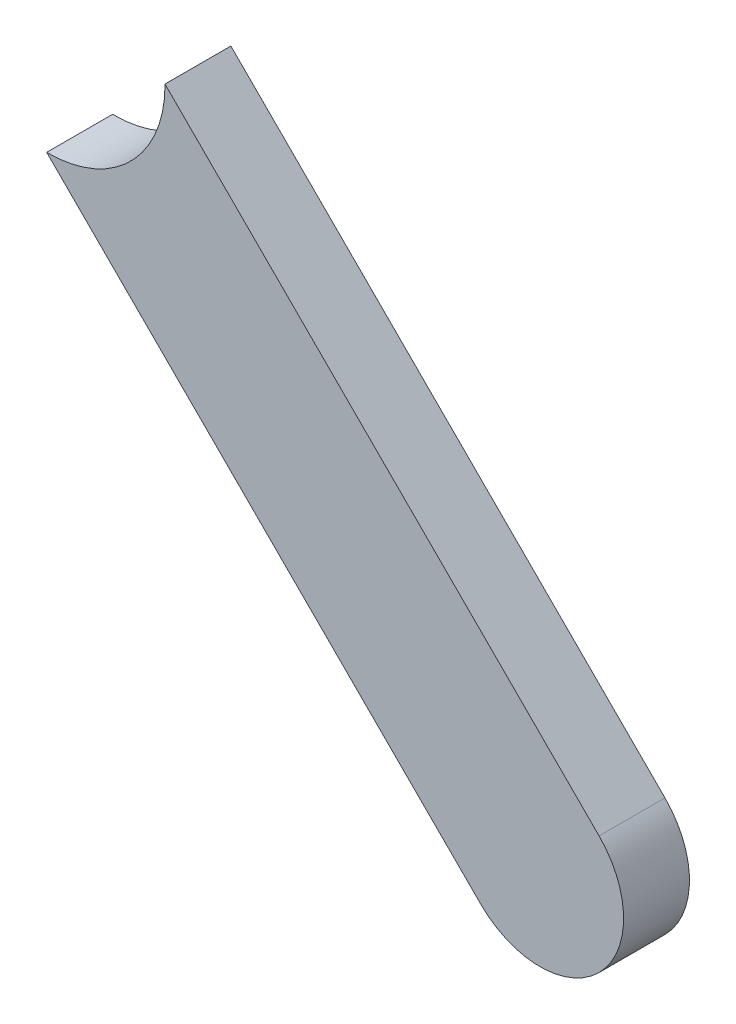
ISO-10303-21;
HEADER;
FILE_DESCRIPTION(('STEP AP214'),'2;1');
FILE_NAME('part.step','',(''),(''),'','','');
FILE_SCHEMA(('AUTOMOTIVE_DESIGN { 1 0 10303 214 1 1 1 1 }'));
ENDSEC;
DATA;
#1=APPLICATION_CONTEXT('core data for automotive mechanical design processes');
#2=APPLICATION_PROTOCOL_DEFINITION('international standard','automotive_design',2000,#1);
#3=PRODUCT_CONTEXT('',#1,'mechanical');
#4=PRODUCT('Part','Part','',(#3));
#5=PRODUCT_RELATED_PRODUCT_CATEGORY('part','',(#4));
#6=PRODUCT_DEFINITION_FORMATION('','',#4);
#7=PRODUCT_DEFINITION_CONTEXT('part definition',#1,'design');
#8=PRODUCT_DEFINITION('design','',#6,#7);
#9=PRODUCT_DEFINITION_SHAPE('','',#8);
#10=(LENGTH_UNIT() NAMED_UNIT(*) SI_UNIT(.MILLI.,.METRE.));
#11=(NAMED_UNIT(*) PLANE_ANGLE_UNIT() SI_UNIT($,.RADIAN.));
#12=(NAMED_UNIT(*) SI_UNIT($,.STERADIAN.) SOLID_ANGLE_UNIT());
#13=UNCERTAINTY_MEASURE_WITH_UNIT(LENGTH_MEASURE(1.E-05),#10,'distance_accuracy_value','');
#14=(GEOMETRIC_REPRESENTATION_CONTEXT(3) GLOBAL_UNCERTAINTY_ASSIGNED_CONTEXT((#13)) GLOBAL_UNIT_ASSIGNED_CONTEXT((#10,
#11,#12)) REPRESENTATION_CONTEXT('',''));
#15=CARTESIAN_POINT('',(0.,0.,0.));
#16=DIRECTION('',(0.,0.,1.));
#17=DIRECTION('',(1.,0.,0.));
#18=AXIS2_PLACEMENT_3D('',#15,#16,#17);
#19=CARTESIAN_POINT('',(145.284369587607,113.309418532393,0.));
#20=DIRECTION('',(0.707106781186548,0.707106781186548,0.));
#21=DIRECTION('',(0.707106781186548,-0.707106781186548,0.));
#22=AXIS2_PLACEMENT_3D('',#19,#20,#21);
#23=PLANE('',#22);
#24=DIRECTION('',(0.707106781186548,-0.707106781186548,0.));
#25=VECTOR('',#24,1.);
#26=CARTESIAN_POINT('',(145.10839406,113.48539406,0.1999996));
#27=LINE('',#26,#25);
#28=CARTESIAN_POINT('',(145.284369587607,113.309418532393,0.1999996));
#29=VERTEX_POINT('',#28);
#30=CARTESIAN_POINT('',(146.60242206,111.99136606,0.1999996));
#31=VERTEX_POINT('',#30);
#32=EDGE_CURVE('E11',#29,#31,#27,.T.);
#33=ORIENTED_EDGE('',*,*,#32,.F.);
#34=DIRECTION('',(0.,0.,1.));
#35=VECTOR('',#34,1.);
#36=CARTESIAN_POINT('',(145.284369587607,113.309418532393,0.));
#37=LINE('',#36,#35);
#38=CARTESIAN_POINT('',(145.284369587607,113.309418532393,0.));
#39=VERTEX_POINT('',#38);
#40=EDGE_CURVE('E24',#39,#29,#37,.T.);
#41=ORIENTED_EDGE('',*,*,#40,.F.);
#42=DIRECTION('',(0.707106781186548,-0.707106781186548,0.));
#43=VECTOR('',#42,1.);
#44=CARTESIAN_POINT('',(145.10839406,113.48539406,0.));
#45=LINE('',#44,#43);
#46=CARTESIAN_POINT('',(146.60242206,111.99136606,0.));
#47=VERTEX_POINT('',#46);
#48=EDGE_CURVE('E82',#39,#47,#45,.T.);
#49=ORIENTED_EDGE('',*,*,#48,.T.);
#50=DIRECTION('',(0.,0.,1.));
#51=VECTOR('',#50,1.);
#52=CARTESIAN_POINT('',(146.60242206,111.99136606,0.));
#53=LINE('',#52,#51);
#54=EDGE_CURVE('E37',#47,#31,#53,.T.);
#55=ORIENTED_EDGE('',*,*,#54,.T.);
#56=EDGE_LOOP('',(#33,#41,#49,#55));
#57=FACE_BOUND('',#56,.T.);
#58=ADVANCED_FACE('F17',(#57),#23,.F.);
#59=CARTESIAN_POINT('',(146.782028,112.170972,0.));
#60=DIRECTION('',(0.,0.,-1.));
#61=DIRECTION('',(-0.70710678118652,-0.707106781186576,0.));
#62=AXIS2_PLACEMENT_3D('',#59,#60,#61);
#63=CYLINDRICAL_SURFACE('',#62,0.254001156230771);
#64=CARTESIAN_POINT('',(146.782028,112.170972,0.1999996));
#65=DIRECTION('',(0.,0.,1.));
#66=DIRECTION('',(-0.70710678118652,-0.707106781186576,0.));
#67=AXIS2_PLACEMENT_3D('',#64,#65,#66);
#68=CIRCLE('',#67,0.254001156230771);
#69=CARTESIAN_POINT('',(146.96163394,112.35057794,0.1999996));
#70=VERTEX_POINT('',#69);
#71=EDGE_CURVE('E97',#31,#70,#68,.T.);
#72=ORIENTED_EDGE('',*,*,#71,.F.);
#73=ORIENTED_EDGE('',*,*,#54,.F.);
#74=CARTESIAN_POINT('',(146.782028,112.170972,0.));
#75=DIRECTION('',(0.,0.,1.));
#76=DIRECTION('',(-0.70710678118652,-0.707106781186576,0.));
#77=AXIS2_PLACEMENT_3D('',#74,#75,#76);
#78=CIRCLE('',#77,0.254001156230771);
#79=CARTESIAN_POINT('',(146.96163394,112.35057794,0.));
#80=VERTEX_POINT('',#79);
#81=EDGE_CURVE('E94',#47,#80,#78,.T.);
#82=ORIENTED_EDGE('',*,*,#81,.T.);
#83=DIRECTION('',(0.,0.,1.));
#84=VECTOR('',#83,1.);
#85=CARTESIAN_POINT('',(146.96163394,112.35057794,0.));
#86=LINE('',#85,#84);
#87=EDGE_CURVE('E92',#80,#70,#86,.T.);
#88=ORIENTED_EDGE('',*,*,#87,.T.);
#89=EDGE_LOOP('',(#72,#73,#82,#88));
#90=FACE_BOUND('',#89,.T.);
#91=ADVANCED_FACE('F103',(#90),#63,.T.);
#92=CARTESIAN_POINT('',(146.96163394,112.35057794,0.));
#93=DIRECTION('',(-0.707106781186551,-0.707106781186544,0.));
#94=DIRECTION('',(-0.707106781186544,0.707106781186551,0.));
#95=AXIS2_PLACEMENT_3D('',#92,#93,#94);
#96=PLANE('',#95);
#97=DIRECTION('',(-0.707106781186544,0.707106781186551,0.));
#98=VECTOR('',#97,1.);
#99=CARTESIAN_POINT('',(146.96163394,112.35057794,0.1999996));
#100=LINE('',#99,#98);
#101=CARTESIAN_POINT('',(145.643581467608,113.668630412393,0.1999996));
#102=VERTEX_POINT('',#101);
#103=EDGE_CURVE('E89',#70,#102,#100,.T.);
#104=ORIENTED_EDGE('',*,*,#103,.F.);
#105=ORIENTED_EDGE('',*,*,#87,.F.);
#106=DIRECTION('',(-0.707106781186544,0.707106781186551,0.));
#107=VECTOR('',#106,1.);
#108=CARTESIAN_POINT('',(146.96163394,112.35057794,0.));
#109=LINE('',#108,#107);
#110=CARTESIAN_POINT('',(145.643581467608,113.668630412393,0.));
#111=VERTEX_POINT('',#110);
#112=EDGE_CURVE('E87',#80,#111,#109,.T.);
#113=ORIENTED_EDGE('',*,*,#112,.T.);
#114=DIRECTION('',(0.,0.,1.));
#115=VECTOR('',#114,1.);
#116=CARTESIAN_POINT('',(145.643581467608,113.668630412393,0.));
#117=LINE('',#116,#115);
#118=EDGE_CURVE('E69',#111,#102,#117,.T.);
#119=ORIENTED_EDGE('',*,*,#118,.T.);
#120=EDGE_LOOP('',(#104,#105,#113,#119));
#121=FACE_BOUND('',#120,.T.);
#122=ADVANCED_FACE('F108',(#121),#96,.F.);
#123=CARTESIAN_POINT('',(145.288,113.665,0.));
#124=DIRECTION('',(0.,0.,-1.));
#125=DIRECTION('',(1.,0.,0.));
#126=AXIS2_PLACEMENT_3D('',#123,#124,#125);
#127=CYLINDRICAL_SURFACE('',#126,0.3556);
#128=DIRECTION('',(0.,0.,1.));
#129=VECTOR('',#128,1.);
#130=CARTESIAN_POINT('',(145.6436,113.665,0.));
#131=LINE('',#130,#129);
#132=CARTESIAN_POINT('',(145.6436,113.665,0.));
#133=VERTEX_POINT('',#132);
#134=CARTESIAN_POINT('',(145.6436,113.665,0.1999996));
#135=VERTEX_POINT('',#134);
#136=EDGE_CURVE('E59',#133,#135,#131,.T.);
#137=ORIENTED_EDGE('',*,*,#136,.T.);
#138=CARTESIAN_POINT('',(145.288,113.665,0.1999996));
#139=DIRECTION('',(0.,0.,1.));
#140=DIRECTION('',(1.,0.,0.));
#141=AXIS2_PLACEMENT_3D('',#138,#139,#140);
#142=CIRCLE('',#141,0.3556);
#143=EDGE_CURVE('E70',#135,#102,#142,.T.);
#144=ORIENTED_EDGE('',*,*,#143,.T.);
#145=ORIENTED_EDGE('',*,*,#118,.F.);
#146=CARTESIAN_POINT('',(145.288,113.665,0.));
#147=DIRECTION('',(0.,0.,1.));
#148=DIRECTION('',(1.,0.,0.));
#149=AXIS2_PLACEMENT_3D('',#146,#147,#148);
#150=CIRCLE('',#149,0.3556);
#151=EDGE_CURVE('E73',#133,#111,#150,.T.);
#152=ORIENTED_EDGE('',*,*,#151,.F.);
#153=EDGE_LOOP('',(#137,#144,#145,#152));
#154=FACE_BOUND('',#153,.T.);
#155=ADVANCED_FACE('F74',(#154),#127,.F.);
#156=CARTESIAN_POINT('',(145.288,113.665,0.));
#157=DIRECTION('',(0.,0.,-1.));
#158=DIRECTION('',(1.,0.,0.));
#159=AXIS2_PLACEMENT_3D('',#156,#157,#158);
#160=CYLINDRICAL_SURFACE('',#159,0.3556);
#161=ORIENTED_EDGE('',*,*,#40,.T.);
#162=CARTESIAN_POINT('',(145.288,113.665,0.1999996));
#163=DIRECTION('',(0.,0.,1.));
#164=DIRECTION('',(1.,0.,0.));
#165=AXIS2_PLACEMENT_3D('',#162,#163,#164);
#166=CIRCLE('',#165,0.3556);
#167=EDGE_CURVE('E65',#29,#135,#166,.T.);
#168=ORIENTED_EDGE('',*,*,#167,.T.);
#169=ORIENTED_EDGE('',*,*,#136,.F.);
#170=EDGE_CURVE('E63',#39,#133,#150,.T.);
#171=ORIENTED_EDGE('',*,*,#170,.F.);
#172=EDGE_LOOP('',(#161,#168,#169,#171));
#173=FACE_BOUND('',#172,.T.);
#174=ADVANCED_FACE('F61',(#173),#160,.F.);
#175=CARTESIAN_POINT('',(145.10839406,113.48539406,0.));
#176=DIRECTION('',(0.,0.,-1.));
#177=DIRECTION('',(-1.,0.,0.));
#178=AXIS2_PLACEMENT_3D('',#175,#176,#177);
#179=PLANE('',#178);
#180=ORIENTED_EDGE('',*,*,#48,.F.);
#181=ORIENTED_EDGE('',*,*,#170,.T.);
#182=ORIENTED_EDGE('',*,*,#151,.T.);
#183=ORIENTED_EDGE('',*,*,#112,.F.);
#184=ORIENTED_EDGE('',*,*,#81,.F.);
#185=EDGE_LOOP('',(#180,#181,#182,#183,#184));
#186=FACE_BOUND('',#185,.T.);
#187=ADVANCED_FACE('F80',(#186),#179,.T.);
#188=CARTESIAN_POINT('',(145.10839406,113.48539406,0.1999996));
#189=DIRECTION('',(0.,0.,-1.));
#190=DIRECTION('',(-1.,0.,0.));
#191=AXIS2_PLACEMENT_3D('',#188,#189,#190);
#192=PLANE('',#191);
#193=ORIENTED_EDGE('',*,*,#167,.F.);
#194=ORIENTED_EDGE('',*,*,#32,.T.);
#195=ORIENTED_EDGE('',*,*,#71,.T.);
#196=ORIENTED_EDGE('',*,*,#103,.T.);
#197=ORIENTED_EDGE('',*,*,#143,.F.);
#198=EDGE_LOOP('',(#193,#194,#195,#196,#197));
#199=FACE_BOUND('',#198,.T.);
#200=ADVANCED_FACE('F106',(#199),#192,.F.);
#201=CLOSED_SHELL('',(#58,#91,#122,#155,#174,#187,#200));
#202=MANIFOLD_SOLID_BREP('B1',#201);
#203=ADVANCED_BREP_SHAPE_REPRESENTATION('',(#18,#202),#14);
#204=SHAPE_DEFINITION_REPRESENTATION(#9,#203);
ENDSEC;
END-ISO-10303-21;
